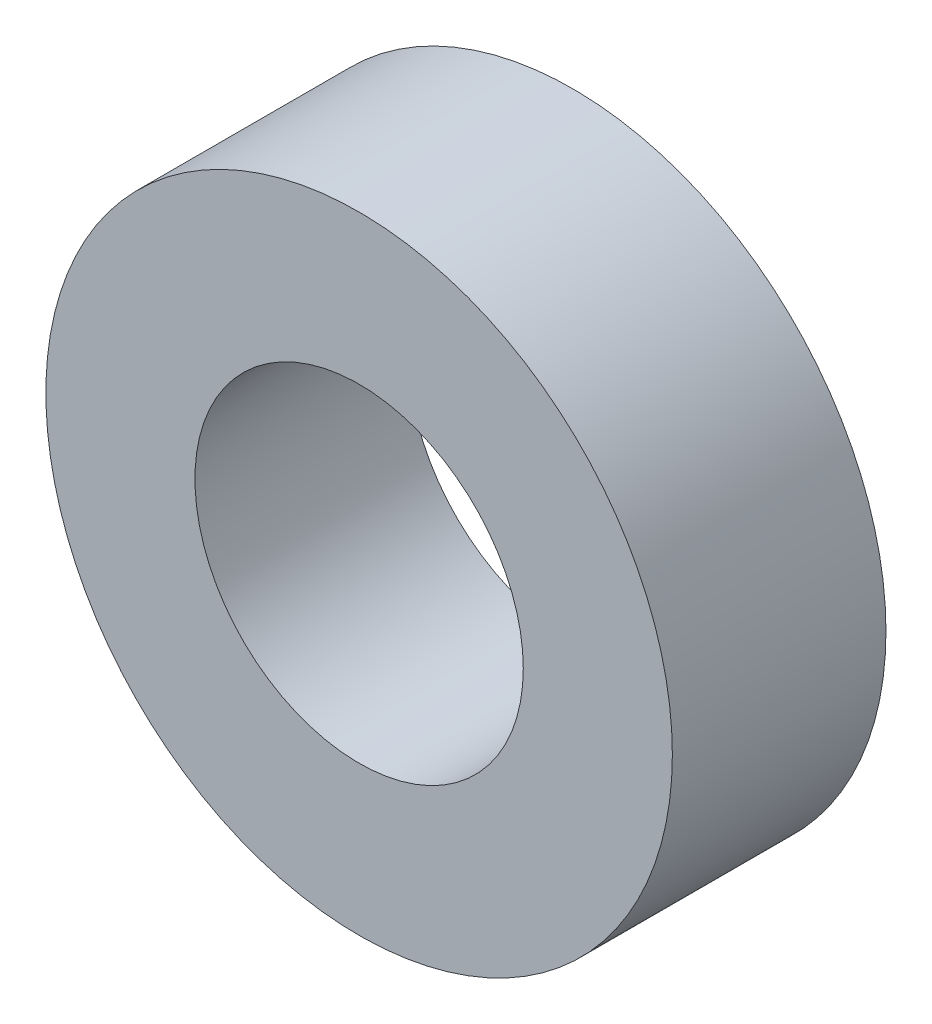
ISO-10303-21;
HEADER;
FILE_DESCRIPTION(('STEP AP214'),'2;1');
FILE_NAME('part.step','',(''),(''),'','','');
FILE_SCHEMA(('AUTOMOTIVE_DESIGN { 1 0 10303 214 1 1 1 1 }'));
ENDSEC;
DATA;
#1=APPLICATION_CONTEXT('core data for automotive mechanical design processes');
#2=APPLICATION_PROTOCOL_DEFINITION('international standard','automotive_design',2000,#1);
#3=PRODUCT_CONTEXT('',#1,'mechanical');
#4=PRODUCT('Part','Part','',(#3));
#5=PRODUCT_RELATED_PRODUCT_CATEGORY('part','',(#4));
#6=PRODUCT_DEFINITION_FORMATION('','',#4);
#7=PRODUCT_DEFINITION_CONTEXT('part definition',#1,'design');
#8=PRODUCT_DEFINITION('design','',#6,#7);
#9=PRODUCT_DEFINITION_SHAPE('','',#8);
#10=(LENGTH_UNIT() NAMED_UNIT(*) SI_UNIT(.MILLI.,.METRE.));
#11=(NAMED_UNIT(*) PLANE_ANGLE_UNIT() SI_UNIT($,.RADIAN.));
#12=(NAMED_UNIT(*) SI_UNIT($,.STERADIAN.) SOLID_ANGLE_UNIT());
#13=UNCERTAINTY_MEASURE_WITH_UNIT(LENGTH_MEASURE(1.E-05),#10,'distance_accuracy_value','');
#14=(GEOMETRIC_REPRESENTATION_CONTEXT(3) GLOBAL_UNCERTAINTY_ASSIGNED_CONTEXT((#13)) GLOBAL_UNIT_ASSIGNED_CONTEXT((#10,
#11,#12)) REPRESENTATION_CONTEXT('',''));
#15=CARTESIAN_POINT('',(0.,0.,0.));
#16=DIRECTION('',(0.,0.,1.));
#17=DIRECTION('',(1.,0.,0.));
#18=AXIS2_PLACEMENT_3D('',#15,#16,#17);
#19=CARTESIAN_POINT('',(0.,0.,5.38));
#20=DIRECTION('',(0.,0.,1.));
#21=DIRECTION('',(1.,0.,0.));
#22=AXIS2_PLACEMENT_3D('',#19,#20,#21);
#23=PLANE('',#22);
#24=CARTESIAN_POINT('',(0.,0.,5.38));
#25=DIRECTION('',(0.,0.,1.));
#26=DIRECTION('',(1.,0.,0.));
#27=AXIS2_PLACEMENT_3D('',#24,#25,#26);
#28=CIRCLE('',#27,7.89);
#29=CARTESIAN_POINT('',(7.89,0.,5.38));
#30=VERTEX_POINT('',#29);
#31=EDGE_CURVE('E10',#30,#30,#28,.T.);
#32=ORIENTED_EDGE('',*,*,#31,.T.);
#33=EDGE_LOOP('',(#32));
#34=FACE_BOUND('',#33,.T.);
#35=CARTESIAN_POINT('',(0.,0.,5.38));
#36=DIRECTION('',(0.,0.,1.));
#37=DIRECTION('',(1.,0.,0.));
#38=AXIS2_PLACEMENT_3D('',#35,#36,#37);
#39=CIRCLE('',#38,4.135);
#40=CARTESIAN_POINT('',(4.135,0.,5.38));
#41=VERTEX_POINT('',#40);
#42=EDGE_CURVE('E48',#41,#41,#39,.T.);
#43=ORIENTED_EDGE('',*,*,#42,.F.);
#44=EDGE_LOOP('',(#43));
#45=FACE_BOUND('',#44,.T.);
#46=ADVANCED_FACE('F37',(#34,#45),#23,.T.);
#47=CARTESIAN_POINT('',(0.,0.,0.));
#48=DIRECTION('',(0.,0.,1.));
#49=DIRECTION('',(1.,0.,0.));
#50=AXIS2_PLACEMENT_3D('',#47,#48,#49);
#51=PLANE('',#50);
#52=CARTESIAN_POINT('',(0.,0.,0.));
#53=DIRECTION('',(0.,0.,1.));
#54=DIRECTION('',(1.,0.,0.));
#55=AXIS2_PLACEMENT_3D('',#52,#53,#54);
#56=CIRCLE('',#55,7.89);
#57=CARTESIAN_POINT('',(7.89,0.,0.));
#58=VERTEX_POINT('',#57);
#59=EDGE_CURVE('E41',#58,#58,#56,.T.);
#60=ORIENTED_EDGE('',*,*,#59,.F.);
#61=EDGE_LOOP('',(#60));
#62=FACE_BOUND('',#61,.T.);
#63=CARTESIAN_POINT('',(0.,0.,0.));
#64=DIRECTION('',(0.,0.,1.));
#65=DIRECTION('',(1.,0.,0.));
#66=AXIS2_PLACEMENT_3D('',#63,#64,#65);
#67=CIRCLE('',#66,4.135);
#68=CARTESIAN_POINT('',(4.135,0.,0.));
#69=VERTEX_POINT('',#68);
#70=EDGE_CURVE('E50',#69,#69,#67,.T.);
#71=ORIENTED_EDGE('',*,*,#70,.T.);
#72=EDGE_LOOP('',(#71));
#73=FACE_BOUND('',#72,.T.);
#74=ADVANCED_FACE('F60',(#62,#73),#51,.F.);
#75=CARTESIAN_POINT('',(0.,0.,5.38));
#76=DIRECTION('',(0.,0.,-1.));
#77=DIRECTION('',(-1.,0.,0.));
#78=AXIS2_PLACEMENT_3D('',#75,#76,#77);
#79=CYLINDRICAL_SURFACE('',#78,7.89);
#80=ORIENTED_EDGE('',*,*,#31,.F.);
#81=EDGE_LOOP('',(#80));
#82=FACE_BOUND('',#81,.T.);
#83=ORIENTED_EDGE('',*,*,#59,.T.);
#84=EDGE_LOOP('',(#83));
#85=FACE_BOUND('',#84,.T.);
#86=ADVANCED_FACE('F39',(#82,#85),#79,.T.);
#87=CARTESIAN_POINT('',(0.,0.,5.38));
#88=DIRECTION('',(0.,0.,-1.));
#89=DIRECTION('',(-1.,0.,0.));
#90=AXIS2_PLACEMENT_3D('',#87,#88,#89);
#91=CYLINDRICAL_SURFACE('',#90,4.135);
#92=ORIENTED_EDGE('',*,*,#42,.T.);
#93=EDGE_LOOP('',(#92));
#94=FACE_BOUND('',#93,.T.);
#95=ORIENTED_EDGE('',*,*,#70,.F.);
#96=EDGE_LOOP('',(#95));
#97=FACE_BOUND('',#96,.T.);
#98=ADVANCED_FACE('F56',(#94,#97),#91,.F.);
#99=CLOSED_SHELL('',(#46,#74,#86,#98));
#100=MANIFOLD_SOLID_BREP('B2',#99);
#101=ADVANCED_BREP_SHAPE_REPRESENTATION('',(#18,#100),#14);
#102=SHAPE_DEFINITION_REPRESENTATION(#9,#101);
ENDSEC;
END-ISO-10303-21;
